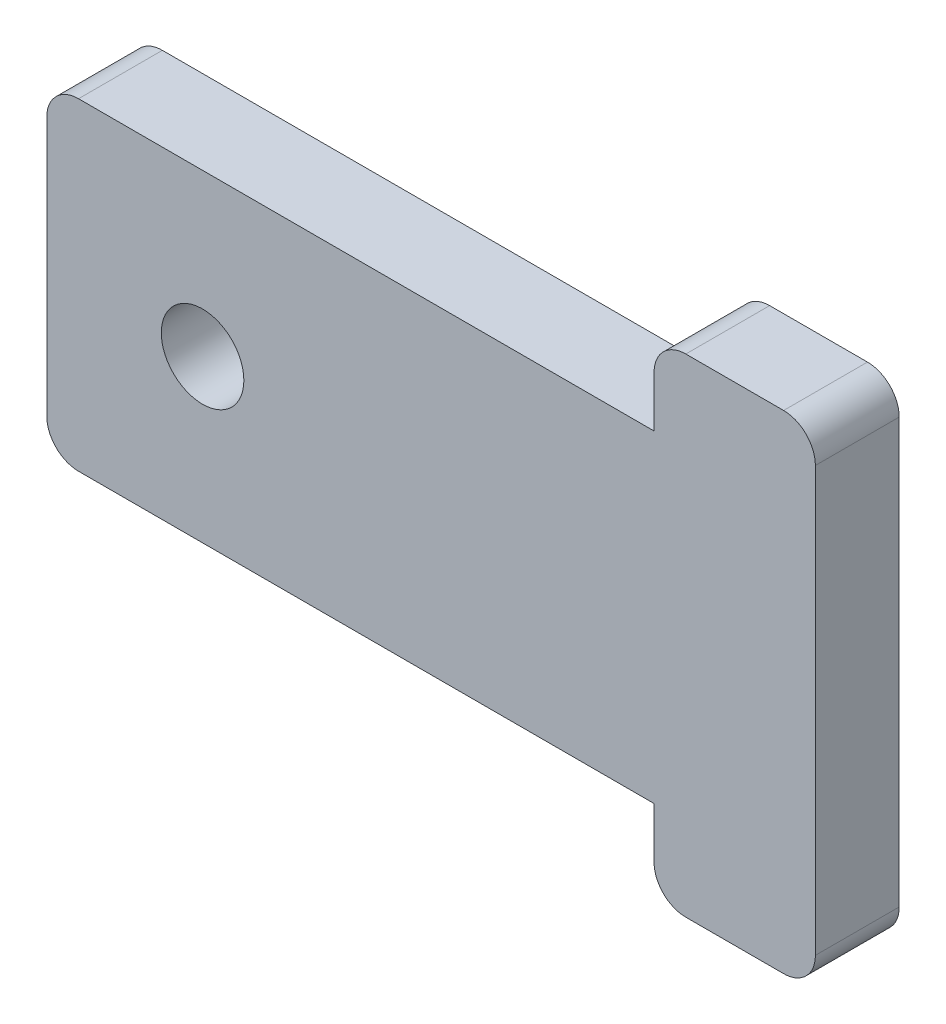
ISO-10303-21;
HEADER;
FILE_DESCRIPTION(('STEP AP214'),'2;1');
FILE_NAME('part.step','',(''),(''),'','','');
FILE_SCHEMA(('AUTOMOTIVE_DESIGN { 1 0 10303 214 1 1 1 1 }'));
ENDSEC;
DATA;
#1=APPLICATION_CONTEXT('core data for automotive mechanical design processes');
#2=APPLICATION_PROTOCOL_DEFINITION('international standard','automotive_design',2000,#1);
#3=PRODUCT_CONTEXT('',#1,'mechanical');
#4=PRODUCT('Part','Part','',(#3));
#5=PRODUCT_RELATED_PRODUCT_CATEGORY('part','',(#4));
#6=PRODUCT_DEFINITION_FORMATION('','',#4);
#7=PRODUCT_DEFINITION_CONTEXT('part definition',#1,'design');
#8=PRODUCT_DEFINITION('design','',#6,#7);
#9=PRODUCT_DEFINITION_SHAPE('','',#8);
#10=(LENGTH_UNIT() NAMED_UNIT(*) SI_UNIT(.MILLI.,.METRE.));
#11=(NAMED_UNIT(*) PLANE_ANGLE_UNIT() SI_UNIT($,.RADIAN.));
#12=(NAMED_UNIT(*) SI_UNIT($,.STERADIAN.) SOLID_ANGLE_UNIT());
#13=UNCERTAINTY_MEASURE_WITH_UNIT(LENGTH_MEASURE(1.E-05),#10,'distance_accuracy_value','');
#14=(GEOMETRIC_REPRESENTATION_CONTEXT(3) GLOBAL_UNCERTAINTY_ASSIGNED_CONTEXT((#13)) GLOBAL_UNIT_ASSIGNED_CONTEXT((#10,
#11,#12)) REPRESENTATION_CONTEXT('',''));
#15=CARTESIAN_POINT('',(0.,0.,0.));
#16=DIRECTION('',(0.,0.,1.));
#17=DIRECTION('',(1.,0.,0.));
#18=AXIS2_PLACEMENT_3D('',#15,#16,#17);
#19=CARTESIAN_POINT('',(2.49999999999999,22.9,6.6));
#20=DIRECTION('',(0.,0.,1.));
#21=DIRECTION('',(1.,0.,0.));
#22=AXIS2_PLACEMENT_3D('',#19,#20,#21);
#23=PLANE('',#22);
#24=CARTESIAN_POINT('',(2.49999999999999,22.9,6.6));
#25=DIRECTION('',(0.,0.,1.));
#26=DIRECTION('',(1.,0.,0.));
#27=AXIS2_PLACEMENT_3D('',#24,#25,#26);
#28=CIRCLE('',#27,2.49999999999999);
#29=CARTESIAN_POINT('',(2.5,25.4,6.6));
#30=VERTEX_POINT('',#29);
#31=CARTESIAN_POINT('',(0.,22.9,6.6));
#32=VERTEX_POINT('',#31);
#33=EDGE_CURVE('E193',#30,#32,#28,.T.);
#34=ORIENTED_EDGE('',*,*,#33,.T.);
#35=DIRECTION('',(0.,-1.,0.));
#36=VECTOR('',#35,1.);
#37=CARTESIAN_POINT('',(0.,22.9,6.6));
#38=LINE('',#37,#36);
#39=CARTESIAN_POINT('',(0.,2.5,6.6));
#40=VERTEX_POINT('',#39);
#41=EDGE_CURVE('E111',#32,#40,#38,.T.);
#42=ORIENTED_EDGE('',*,*,#41,.T.);
#43=CARTESIAN_POINT('',(2.5,2.5,6.6));
#44=DIRECTION('',(0.,0.,1.));
#45=DIRECTION('',(1.,0.,0.));
#46=AXIS2_PLACEMENT_3D('',#43,#44,#45);
#47=CIRCLE('',#46,2.5);
#48=CARTESIAN_POINT('',(2.5,0.,6.6));
#49=VERTEX_POINT('',#48);
#50=EDGE_CURVE('E226',#40,#49,#47,.T.);
#51=ORIENTED_EDGE('',*,*,#50,.T.);
#52=DIRECTION('',(1.,0.,0.));
#53=VECTOR('',#52,1.);
#54=CARTESIAN_POINT('',(2.5,0.,6.6));
#55=LINE('',#54,#53);
#56=CARTESIAN_POINT('',(47.81,0.,6.6));
#57=VERTEX_POINT('',#56);
#58=EDGE_CURVE('E245',#49,#57,#55,.T.);
#59=ORIENTED_EDGE('',*,*,#58,.T.);
#60=DIRECTION('',(0.,-1.,0.));
#61=VECTOR('',#60,1.);
#62=CARTESIAN_POINT('',(47.81,0.,6.6));
#63=LINE('',#62,#61);
#64=CARTESIAN_POINT('',(47.81,-4.,6.6));
#65=VERTEX_POINT('',#64);
#66=EDGE_CURVE('E242',#57,#65,#63,.T.);
#67=ORIENTED_EDGE('',*,*,#66,.T.);
#68=CARTESIAN_POINT('',(50.31,-4.00000000000001,6.6));
#69=DIRECTION('',(0.,0.,1.));
#70=DIRECTION('',(1.,0.,0.));
#71=AXIS2_PLACEMENT_3D('',#68,#69,#70);
#72=CIRCLE('',#71,2.5);
#73=CARTESIAN_POINT('',(50.31,-6.5,6.6));
#74=VERTEX_POINT('',#73);
#75=EDGE_CURVE('E244',#65,#74,#72,.T.);
#76=ORIENTED_EDGE('',*,*,#75,.T.);
#77=DIRECTION('',(1.,0.,0.));
#78=VECTOR('',#77,1.);
#79=CARTESIAN_POINT('',(50.31,-6.5,6.6));
#80=LINE('',#79,#78);
#81=CARTESIAN_POINT('',(58.01,-6.5,6.6));
#82=VERTEX_POINT('',#81);
#83=EDGE_CURVE('E247',#74,#82,#80,.T.);
#84=ORIENTED_EDGE('',*,*,#83,.T.);
#85=CARTESIAN_POINT('',(58.01,-4.00000000000001,6.6));
#86=DIRECTION('',(0.,0.,1.));
#87=DIRECTION('',(1.,0.,0.));
#88=AXIS2_PLACEMENT_3D('',#85,#86,#87);
#89=CIRCLE('',#88,2.49999999999999);
#90=CARTESIAN_POINT('',(60.51,-4.,6.6));
#91=VERTEX_POINT('',#90);
#92=EDGE_CURVE('E253',#82,#91,#89,.T.);
#93=ORIENTED_EDGE('',*,*,#92,.T.);
#94=DIRECTION('',(0.,1.,0.));
#95=VECTOR('',#94,1.);
#96=CARTESIAN_POINT('',(60.51,-4.,6.6));
#97=LINE('',#96,#95);
#98=CARTESIAN_POINT('',(60.51,29.4,6.6));
#99=VERTEX_POINT('',#98);
#100=EDGE_CURVE('E255',#91,#99,#97,.T.);
#101=ORIENTED_EDGE('',*,*,#100,.T.);
#102=CARTESIAN_POINT('',(58.01,29.4,6.6));
#103=DIRECTION('',(0.,0.,1.));
#104=DIRECTION('',(1.,0.,0.));
#105=AXIS2_PLACEMENT_3D('',#102,#103,#104);
#106=CIRCLE('',#105,2.49999999999999);
#107=CARTESIAN_POINT('',(58.01,31.9,6.6));
#108=VERTEX_POINT('',#107);
#109=EDGE_CURVE('E257',#99,#108,#106,.T.);
#110=ORIENTED_EDGE('',*,*,#109,.T.);
#111=DIRECTION('',(-1.,0.,0.));
#112=VECTOR('',#111,1.);
#113=CARTESIAN_POINT('',(58.01,31.9,6.6));
#114=LINE('',#113,#112);
#115=CARTESIAN_POINT('',(50.31,31.9,6.6));
#116=VERTEX_POINT('',#115);
#117=EDGE_CURVE('E148',#108,#116,#114,.T.);
#118=ORIENTED_EDGE('',*,*,#117,.T.);
#119=CARTESIAN_POINT('',(50.31,29.4,6.6));
#120=DIRECTION('',(0.,0.,1.));
#121=DIRECTION('',(1.,0.,0.));
#122=AXIS2_PLACEMENT_3D('',#119,#120,#121);
#123=CIRCLE('',#122,2.50000000000003);
#124=CARTESIAN_POINT('',(47.81,29.4,6.6));
#125=VERTEX_POINT('',#124);
#126=EDGE_CURVE('E142',#116,#125,#123,.T.);
#127=ORIENTED_EDGE('',*,*,#126,.T.);
#128=DIRECTION('',(0.,-1.,0.));
#129=VECTOR('',#128,1.);
#130=CARTESIAN_POINT('',(47.81,29.4,6.6));
#131=LINE('',#130,#129);
#132=CARTESIAN_POINT('',(47.81,25.4,6.6));
#133=VERTEX_POINT('',#132);
#134=EDGE_CURVE('E146',#125,#133,#131,.T.);
#135=ORIENTED_EDGE('',*,*,#134,.T.);
#136=DIRECTION('',(-1.,0.,0.));
#137=VECTOR('',#136,1.);
#138=CARTESIAN_POINT('',(47.81,25.4,6.6));
#139=LINE('',#138,#137);
#140=EDGE_CURVE('E50',#133,#30,#139,.T.);
#141=ORIENTED_EDGE('',*,*,#140,.T.);
#142=EDGE_LOOP('',(#34,#42,#51,#59,#67,#76,#84,#93,#101,#110,#118,#127,#135,#141));
#143=FACE_BOUND('',#142,.T.);
#144=CARTESIAN_POINT('',(12.2648073581,12.7,6.6));
#145=DIRECTION('',(0.,0.,1.));
#146=DIRECTION('',(1.,0.,0.));
#147=AXIS2_PLACEMENT_3D('',#144,#145,#146);
#148=CIRCLE('',#147,3.25000000000001);
#149=CARTESIAN_POINT('',(15.5148073581,12.7,6.6));
#150=VERTEX_POINT('',#149);
#151=EDGE_CURVE('E170',#150,#150,#148,.T.);
#152=ORIENTED_EDGE('',*,*,#151,.F.);
#153=EDGE_LOOP('',(#152));
#154=FACE_BOUND('',#153,.T.);
#155=ADVANCED_FACE('F33',(#143,#154),#23,.T.);
#156=CARTESIAN_POINT('',(2.49999999999999,22.9,0.));
#157=DIRECTION('',(0.,0.,1.));
#158=DIRECTION('',(1.,0.,0.));
#159=AXIS2_PLACEMENT_3D('',#156,#157,#158);
#160=PLANE('',#159);
#161=CARTESIAN_POINT('',(2.49999999999999,22.9,0.));
#162=DIRECTION('',(0.,0.,1.));
#163=DIRECTION('',(1.,0.,0.));
#164=AXIS2_PLACEMENT_3D('',#161,#162,#163);
#165=CIRCLE('',#164,2.49999999999999);
#166=CARTESIAN_POINT('',(2.5,25.4,0.));
#167=VERTEX_POINT('',#166);
#168=CARTESIAN_POINT('',(0.,22.9,0.));
#169=VERTEX_POINT('',#168);
#170=EDGE_CURVE('E166',#167,#169,#165,.T.);
#171=ORIENTED_EDGE('',*,*,#170,.F.);
#172=DIRECTION('',(-1.,0.,0.));
#173=VECTOR('',#172,1.);
#174=CARTESIAN_POINT('',(47.81,25.4,0.));
#175=LINE('',#174,#173);
#176=CARTESIAN_POINT('',(47.81,25.4,0.));
#177=VERTEX_POINT('',#176);
#178=EDGE_CURVE('E103',#177,#167,#175,.T.);
#179=ORIENTED_EDGE('',*,*,#178,.F.);
#180=DIRECTION('',(0.,-1.,0.));
#181=VECTOR('',#180,1.);
#182=CARTESIAN_POINT('',(47.81,29.4,0.));
#183=LINE('',#182,#181);
#184=CARTESIAN_POINT('',(47.81,29.4,0.));
#185=VERTEX_POINT('',#184);
#186=EDGE_CURVE('E97',#185,#177,#183,.T.);
#187=ORIENTED_EDGE('',*,*,#186,.F.);
#188=CARTESIAN_POINT('',(50.31,29.4,0.));
#189=DIRECTION('',(0.,0.,1.));
#190=DIRECTION('',(1.,0.,0.));
#191=AXIS2_PLACEMENT_3D('',#188,#189,#190);
#192=CIRCLE('',#191,2.50000000000003);
#193=CARTESIAN_POINT('',(50.31,31.9,0.));
#194=VERTEX_POINT('',#193);
#195=EDGE_CURVE('E156',#194,#185,#192,.T.);
#196=ORIENTED_EDGE('',*,*,#195,.F.);
#197=DIRECTION('',(-1.,0.,0.));
#198=VECTOR('',#197,1.);
#199=CARTESIAN_POINT('',(58.01,31.9,0.));
#200=LINE('',#199,#198);
#201=CARTESIAN_POINT('',(58.01,31.9,0.));
#202=VERTEX_POINT('',#201);
#203=EDGE_CURVE('E188',#202,#194,#200,.T.);
#204=ORIENTED_EDGE('',*,*,#203,.F.);
#205=CARTESIAN_POINT('',(58.01,29.4,0.));
#206=DIRECTION('',(0.,0.,1.));
#207=DIRECTION('',(1.,0.,0.));
#208=AXIS2_PLACEMENT_3D('',#205,#206,#207);
#209=CIRCLE('',#208,2.49999999999999);
#210=CARTESIAN_POINT('',(60.51,29.4,0.));
#211=VERTEX_POINT('',#210);
#212=EDGE_CURVE('E186',#211,#202,#209,.T.);
#213=ORIENTED_EDGE('',*,*,#212,.F.);
#214=DIRECTION('',(0.,1.,0.));
#215=VECTOR('',#214,1.);
#216=CARTESIAN_POINT('',(60.51,-4.,0.));
#217=LINE('',#216,#215);
#218=CARTESIAN_POINT('',(60.51,-4.,0.));
#219=VERTEX_POINT('',#218);
#220=EDGE_CURVE('E184',#219,#211,#217,.T.);
#221=ORIENTED_EDGE('',*,*,#220,.F.);
#222=CARTESIAN_POINT('',(58.01,-4.00000000000001,0.));
#223=DIRECTION('',(0.,0.,1.));
#224=DIRECTION('',(1.,0.,0.));
#225=AXIS2_PLACEMENT_3D('',#222,#223,#224);
#226=CIRCLE('',#225,2.49999999999999);
#227=CARTESIAN_POINT('',(58.01,-6.5,0.));
#228=VERTEX_POINT('',#227);
#229=EDGE_CURVE('E182',#228,#219,#226,.T.);
#230=ORIENTED_EDGE('',*,*,#229,.F.);
#231=DIRECTION('',(1.,0.,0.));
#232=VECTOR('',#231,1.);
#233=CARTESIAN_POINT('',(50.31,-6.5,0.));
#234=LINE('',#233,#232);
#235=CARTESIAN_POINT('',(50.31,-6.5,0.));
#236=VERTEX_POINT('',#235);
#237=EDGE_CURVE('E180',#236,#228,#234,.T.);
#238=ORIENTED_EDGE('',*,*,#237,.F.);
#239=CARTESIAN_POINT('',(50.31,-4.00000000000001,0.));
#240=DIRECTION('',(0.,0.,1.));
#241=DIRECTION('',(1.,0.,0.));
#242=AXIS2_PLACEMENT_3D('',#239,#240,#241);
#243=CIRCLE('',#242,2.5);
#244=CARTESIAN_POINT('',(47.81,-4.,0.));
#245=VERTEX_POINT('',#244);
#246=EDGE_CURVE('E178',#245,#236,#243,.T.);
#247=ORIENTED_EDGE('',*,*,#246,.F.);
#248=DIRECTION('',(0.,-1.,0.));
#249=VECTOR('',#248,1.);
#250=CARTESIAN_POINT('',(47.81,0.,0.));
#251=LINE('',#250,#249);
#252=CARTESIAN_POINT('',(47.81,0.,0.));
#253=VERTEX_POINT('',#252);
#254=EDGE_CURVE('E176',#253,#245,#251,.T.);
#255=ORIENTED_EDGE('',*,*,#254,.F.);
#256=DIRECTION('',(1.,0.,0.));
#257=VECTOR('',#256,1.);
#258=CARTESIAN_POINT('',(2.5,0.,0.));
#259=LINE('',#258,#257);
#260=CARTESIAN_POINT('',(2.5,0.,0.));
#261=VERTEX_POINT('',#260);
#262=EDGE_CURVE('E174',#261,#253,#259,.T.);
#263=ORIENTED_EDGE('',*,*,#262,.F.);
#264=CARTESIAN_POINT('',(2.5,2.5,0.));
#265=DIRECTION('',(0.,0.,1.));
#266=DIRECTION('',(1.,0.,0.));
#267=AXIS2_PLACEMENT_3D('',#264,#265,#266);
#268=CIRCLE('',#267,2.5);
#269=CARTESIAN_POINT('',(0.,2.5,0.));
#270=VERTEX_POINT('',#269);
#271=EDGE_CURVE('E172',#270,#261,#268,.T.);
#272=ORIENTED_EDGE('',*,*,#271,.F.);
#273=DIRECTION('',(0.,-1.,0.));
#274=VECTOR('',#273,1.);
#275=CARTESIAN_POINT('',(0.,22.9,0.));
#276=LINE('',#275,#274);
#277=EDGE_CURVE('E169',#169,#270,#276,.T.);
#278=ORIENTED_EDGE('',*,*,#277,.F.);
#279=EDGE_LOOP('',(#171,#179,#187,#196,#204,#213,#221,#230,#238,#247,#255,#263,#272,#278));
#280=FACE_BOUND('',#279,.T.);
#281=CARTESIAN_POINT('',(12.2648073581,12.7,0.));
#282=DIRECTION('',(0.,0.,1.));
#283=DIRECTION('',(1.,0.,0.));
#284=AXIS2_PLACEMENT_3D('',#281,#282,#283);
#285=CIRCLE('',#284,3.25000000000001);
#286=CARTESIAN_POINT('',(15.5148073581,12.7,0.));
#287=VERTEX_POINT('',#286);
#288=EDGE_CURVE('E430',#287,#287,#285,.T.);
#289=ORIENTED_EDGE('',*,*,#288,.T.);
#290=EDGE_LOOP('',(#289));
#291=FACE_BOUND('',#290,.T.);
#292=ADVANCED_FACE('F230',(#280,#291),#160,.F.);
#293=CARTESIAN_POINT('',(2.49999999999999,22.9,6.6));
#294=DIRECTION('',(0.,0.,-1.));
#295=DIRECTION('',(-1.,0.,0.));
#296=AXIS2_PLACEMENT_3D('',#293,#294,#295);
#297=CYLINDRICAL_SURFACE('',#296,2.49999999999999);
#298=ORIENTED_EDGE('',*,*,#170,.T.);
#299=DIRECTION('',(0.,0.,-1.));
#300=VECTOR('',#299,1.);
#301=CARTESIAN_POINT('',(0.,22.9,6.6));
#302=LINE('',#301,#300);
#303=EDGE_CURVE('E11',#32,#169,#302,.T.);
#304=ORIENTED_EDGE('',*,*,#303,.F.);
#305=ORIENTED_EDGE('',*,*,#33,.F.);
#306=DIRECTION('',(0.,0.,-1.));
#307=VECTOR('',#306,1.);
#308=CARTESIAN_POINT('',(2.5,25.4,6.6));
#309=LINE('',#308,#307);
#310=EDGE_CURVE('E162',#30,#167,#309,.T.);
#311=ORIENTED_EDGE('',*,*,#310,.T.);
#312=EDGE_LOOP('',(#298,#304,#305,#311));
#313=FACE_BOUND('',#312,.T.);
#314=ADVANCED_FACE('F35',(#313),#297,.T.);
#315=CARTESIAN_POINT('',(0.,22.9,6.6));
#316=DIRECTION('',(1.,0.,0.));
#317=DIRECTION('',(0.,0.,-1.));
#318=AXIS2_PLACEMENT_3D('',#315,#316,#317);
#319=PLANE('',#318);
#320=ORIENTED_EDGE('',*,*,#277,.T.);
#321=DIRECTION('',(0.,0.,-1.));
#322=VECTOR('',#321,1.);
#323=CARTESIAN_POINT('',(0.,2.5,6.6));
#324=LINE('',#323,#322);
#325=EDGE_CURVE('E42',#40,#270,#324,.T.);
#326=ORIENTED_EDGE('',*,*,#325,.F.);
#327=ORIENTED_EDGE('',*,*,#41,.F.);
#328=ORIENTED_EDGE('',*,*,#303,.T.);
#329=EDGE_LOOP('',(#320,#326,#327,#328));
#330=FACE_BOUND('',#329,.T.);
#331=ADVANCED_FACE('F291',(#330),#319,.F.);
#332=CARTESIAN_POINT('',(2.5,2.5,6.6));
#333=DIRECTION('',(0.,0.,-1.));
#334=DIRECTION('',(-1.,0.,0.));
#335=AXIS2_PLACEMENT_3D('',#332,#333,#334);
#336=CYLINDRICAL_SURFACE('',#335,2.5);
#337=ORIENTED_EDGE('',*,*,#271,.T.);
#338=DIRECTION('',(0.,0.,-1.));
#339=VECTOR('',#338,1.);
#340=CARTESIAN_POINT('',(2.5,0.,6.6));
#341=LINE('',#340,#339);
#342=EDGE_CURVE('E218',#49,#261,#341,.T.);
#343=ORIENTED_EDGE('',*,*,#342,.F.);
#344=ORIENTED_EDGE('',*,*,#50,.F.);
#345=ORIENTED_EDGE('',*,*,#325,.T.);
#346=EDGE_LOOP('',(#337,#343,#344,#345));
#347=FACE_BOUND('',#346,.T.);
#348=ADVANCED_FACE('F224',(#347),#336,.T.);
#349=CARTESIAN_POINT('',(2.5,0.,6.6));
#350=DIRECTION('',(0.,1.,0.));
#351=DIRECTION('',(0.,0.,1.));
#352=AXIS2_PLACEMENT_3D('',#349,#350,#351);
#353=PLANE('',#352);
#354=ORIENTED_EDGE('',*,*,#262,.T.);
#355=DIRECTION('',(0.,0.,-1.));
#356=VECTOR('',#355,1.);
#357=CARTESIAN_POINT('',(47.81,0.,6.6));
#358=LINE('',#357,#356);
#359=EDGE_CURVE('E215',#57,#253,#358,.T.);
#360=ORIENTED_EDGE('',*,*,#359,.F.);
#361=ORIENTED_EDGE('',*,*,#58,.F.);
#362=ORIENTED_EDGE('',*,*,#342,.T.);
#363=EDGE_LOOP('',(#354,#360,#361,#362));
#364=FACE_BOUND('',#363,.T.);
#365=ADVANCED_FACE('F236',(#364),#353,.F.);
#366=CARTESIAN_POINT('',(47.81,0.,6.6));
#367=DIRECTION('',(1.,0.,0.));
#368=DIRECTION('',(0.,0.,-1.));
#369=AXIS2_PLACEMENT_3D('',#366,#367,#368);
#370=PLANE('',#369);
#371=ORIENTED_EDGE('',*,*,#254,.T.);
#372=DIRECTION('',(0.,0.,-1.));
#373=VECTOR('',#372,1.);
#374=CARTESIAN_POINT('',(47.81,-4.,6.6));
#375=LINE('',#374,#373);
#376=EDGE_CURVE('E212',#65,#245,#375,.T.);
#377=ORIENTED_EDGE('',*,*,#376,.F.);
#378=ORIENTED_EDGE('',*,*,#66,.F.);
#379=ORIENTED_EDGE('',*,*,#359,.T.);
#380=EDGE_LOOP('',(#371,#377,#378,#379));
#381=FACE_BOUND('',#380,.T.);
#382=ADVANCED_FACE('F240',(#381),#370,.F.);
#383=CARTESIAN_POINT('',(50.31,-4.00000000000001,6.6));
#384=DIRECTION('',(0.,0.,-1.));
#385=DIRECTION('',(-1.,0.,0.));
#386=AXIS2_PLACEMENT_3D('',#383,#384,#385);
#387=CYLINDRICAL_SURFACE('',#386,2.5);
#388=ORIENTED_EDGE('',*,*,#246,.T.);
#389=DIRECTION('',(0.,0.,-1.));
#390=VECTOR('',#389,1.);
#391=CARTESIAN_POINT('',(50.31,-6.5,6.6));
#392=LINE('',#391,#390);
#393=EDGE_CURVE('E209',#74,#236,#392,.T.);
#394=ORIENTED_EDGE('',*,*,#393,.F.);
#395=ORIENTED_EDGE('',*,*,#75,.F.);
#396=ORIENTED_EDGE('',*,*,#376,.T.);
#397=EDGE_LOOP('',(#388,#394,#395,#396));
#398=FACE_BOUND('',#397,.T.);
#399=ADVANCED_FACE('F304',(#398),#387,.T.);
#400=CARTESIAN_POINT('',(50.31,-6.5,6.6));
#401=DIRECTION('',(0.,1.,0.));
#402=DIRECTION('',(0.,0.,1.));
#403=AXIS2_PLACEMENT_3D('',#400,#401,#402);
#404=PLANE('',#403);
#405=ORIENTED_EDGE('',*,*,#237,.T.);
#406=DIRECTION('',(0.,0.,-1.));
#407=VECTOR('',#406,1.);
#408=CARTESIAN_POINT('',(58.01,-6.5,6.6));
#409=LINE('',#408,#407);
#410=EDGE_CURVE('E206',#82,#228,#409,.T.);
#411=ORIENTED_EDGE('',*,*,#410,.F.);
#412=ORIENTED_EDGE('',*,*,#83,.F.);
#413=ORIENTED_EDGE('',*,*,#393,.T.);
#414=EDGE_LOOP('',(#405,#411,#412,#413));
#415=FACE_BOUND('',#414,.T.);
#416=ADVANCED_FACE('F307',(#415),#404,.F.);
#417=CARTESIAN_POINT('',(58.01,-4.00000000000001,6.6));
#418=DIRECTION('',(0.,0.,-1.));
#419=DIRECTION('',(-1.,0.,0.));
#420=AXIS2_PLACEMENT_3D('',#417,#418,#419);
#421=CYLINDRICAL_SURFACE('',#420,2.49999999999999);
#422=ORIENTED_EDGE('',*,*,#229,.T.);
#423=DIRECTION('',(0.,0.,-1.));
#424=VECTOR('',#423,1.);
#425=CARTESIAN_POINT('',(60.51,-4.,6.6));
#426=LINE('',#425,#424);
#427=EDGE_CURVE('E203',#91,#219,#426,.T.);
#428=ORIENTED_EDGE('',*,*,#427,.F.);
#429=ORIENTED_EDGE('',*,*,#92,.F.);
#430=ORIENTED_EDGE('',*,*,#410,.T.);
#431=EDGE_LOOP('',(#422,#428,#429,#430));
#432=FACE_BOUND('',#431,.T.);
#433=ADVANCED_FACE('F311',(#432),#421,.T.);
#434=CARTESIAN_POINT('',(60.51,-4.,6.6));
#435=DIRECTION('',(-1.,0.,0.));
#436=DIRECTION('',(0.,0.,1.));
#437=AXIS2_PLACEMENT_3D('',#434,#435,#436);
#438=PLANE('',#437);
#439=ORIENTED_EDGE('',*,*,#220,.T.);
#440=DIRECTION('',(0.,0.,-1.));
#441=VECTOR('',#440,1.);
#442=CARTESIAN_POINT('',(60.51,29.4,6.6));
#443=LINE('',#442,#441);
#444=EDGE_CURVE('E200',#99,#211,#443,.T.);
#445=ORIENTED_EDGE('',*,*,#444,.F.);
#446=ORIENTED_EDGE('',*,*,#100,.F.);
#447=ORIENTED_EDGE('',*,*,#427,.T.);
#448=EDGE_LOOP('',(#439,#445,#446,#447));
#449=FACE_BOUND('',#448,.T.);
#450=ADVANCED_FACE('F315',(#449),#438,.F.);
#451=CARTESIAN_POINT('',(58.01,29.4,6.6));
#452=DIRECTION('',(0.,0.,-1.));
#453=DIRECTION('',(-1.,0.,0.));
#454=AXIS2_PLACEMENT_3D('',#451,#452,#453);
#455=CYLINDRICAL_SURFACE('',#454,2.49999999999999);
#456=ORIENTED_EDGE('',*,*,#212,.T.);
#457=DIRECTION('',(0.,0.,-1.));
#458=VECTOR('',#457,1.);
#459=CARTESIAN_POINT('',(58.01,31.9,6.6));
#460=LINE('',#459,#458);
#461=EDGE_CURVE('E197',#108,#202,#460,.T.);
#462=ORIENTED_EDGE('',*,*,#461,.F.);
#463=ORIENTED_EDGE('',*,*,#109,.F.);
#464=ORIENTED_EDGE('',*,*,#444,.T.);
#465=EDGE_LOOP('',(#456,#462,#463,#464));
#466=FACE_BOUND('',#465,.T.);
#467=ADVANCED_FACE('F263',(#466),#455,.T.);
#468=CARTESIAN_POINT('',(58.01,31.9,6.6));
#469=DIRECTION('',(0.,-1.,0.));
#470=DIRECTION('',(0.,0.,-1.));
#471=AXIS2_PLACEMENT_3D('',#468,#469,#470);
#472=PLANE('',#471);
#473=ORIENTED_EDGE('',*,*,#203,.T.);
#474=DIRECTION('',(0.,0.,-1.));
#475=VECTOR('',#474,1.);
#476=CARTESIAN_POINT('',(50.31,31.9,6.6));
#477=LINE('',#476,#475);
#478=EDGE_CURVE('E157',#116,#194,#477,.T.);
#479=ORIENTED_EDGE('',*,*,#478,.F.);
#480=ORIENTED_EDGE('',*,*,#117,.F.);
#481=ORIENTED_EDGE('',*,*,#461,.T.);
#482=EDGE_LOOP('',(#473,#479,#480,#481));
#483=FACE_BOUND('',#482,.T.);
#484=ADVANCED_FACE('F267',(#483),#472,.F.);
#485=CARTESIAN_POINT('',(50.31,29.4,6.6));
#486=DIRECTION('',(0.,0.,-1.));
#487=DIRECTION('',(-1.,0.,0.));
#488=AXIS2_PLACEMENT_3D('',#485,#486,#487);
#489=CYLINDRICAL_SURFACE('',#488,2.50000000000003);
#490=ORIENTED_EDGE('',*,*,#195,.T.);
#491=DIRECTION('',(0.,0.,-1.));
#492=VECTOR('',#491,1.);
#493=CARTESIAN_POINT('',(47.81,29.4,6.6));
#494=LINE('',#493,#492);
#495=EDGE_CURVE('E153',#125,#185,#494,.T.);
#496=ORIENTED_EDGE('',*,*,#495,.F.);
#497=ORIENTED_EDGE('',*,*,#126,.F.);
#498=ORIENTED_EDGE('',*,*,#478,.T.);
#499=EDGE_LOOP('',(#490,#496,#497,#498));
#500=FACE_BOUND('',#499,.T.);
#501=ADVANCED_FACE('F154',(#500),#489,.T.);
#502=CARTESIAN_POINT('',(47.81,29.4,6.6));
#503=DIRECTION('',(1.,0.,0.));
#504=DIRECTION('',(0.,0.,-1.));
#505=AXIS2_PLACEMENT_3D('',#502,#503,#504);
#506=PLANE('',#505);
#507=ORIENTED_EDGE('',*,*,#186,.T.);
#508=DIRECTION('',(0.,0.,-1.));
#509=VECTOR('',#508,1.);
#510=CARTESIAN_POINT('',(47.81,25.4,6.6));
#511=LINE('',#510,#509);
#512=EDGE_CURVE('E158',#133,#177,#511,.T.);
#513=ORIENTED_EDGE('',*,*,#512,.F.);
#514=ORIENTED_EDGE('',*,*,#134,.F.);
#515=ORIENTED_EDGE('',*,*,#495,.T.);
#516=EDGE_LOOP('',(#507,#513,#514,#515));
#517=FACE_BOUND('',#516,.T.);
#518=ADVANCED_FACE('F160',(#517),#506,.F.);
#519=CARTESIAN_POINT('',(47.81,25.4,6.6));
#520=DIRECTION('',(0.,-1.,0.));
#521=DIRECTION('',(0.,0.,-1.));
#522=AXIS2_PLACEMENT_3D('',#519,#520,#521);
#523=PLANE('',#522);
#524=ORIENTED_EDGE('',*,*,#178,.T.);
#525=ORIENTED_EDGE('',*,*,#310,.F.);
#526=ORIENTED_EDGE('',*,*,#140,.F.);
#527=ORIENTED_EDGE('',*,*,#512,.T.);
#528=EDGE_LOOP('',(#524,#525,#526,#527));
#529=FACE_BOUND('',#528,.T.);
#530=ADVANCED_FACE('F271',(#529),#523,.F.);
#531=CARTESIAN_POINT('',(12.2648073581,12.7,6.6));
#532=DIRECTION('',(0.,0.,-1.));
#533=DIRECTION('',(-1.,0.,0.));
#534=AXIS2_PLACEMENT_3D('',#531,#532,#533);
#535=CYLINDRICAL_SURFACE('',#534,3.25000000000001);
#536=ORIENTED_EDGE('',*,*,#151,.T.);
#537=EDGE_LOOP('',(#536));
#538=FACE_BOUND('',#537,.T.);
#539=ORIENTED_EDGE('',*,*,#288,.F.);
#540=EDGE_LOOP('',(#539));
#541=FACE_BOUND('',#540,.T.);
#542=ADVANCED_FACE('F273',(#538,#541),#535,.F.);
#543=CLOSED_SHELL('',(#155,#292,#314,#331,#348,#365,#382,#399,#416,#433,#450,#467,#484,#501,
#518,#530,#542));
#544=MANIFOLD_SOLID_BREP('B2',#543);
#545=ADVANCED_BREP_SHAPE_REPRESENTATION('',(#18,#544),#14);
#546=SHAPE_DEFINITION_REPRESENTATION(#9,#545);
ENDSEC;
END-ISO-10303-21;
